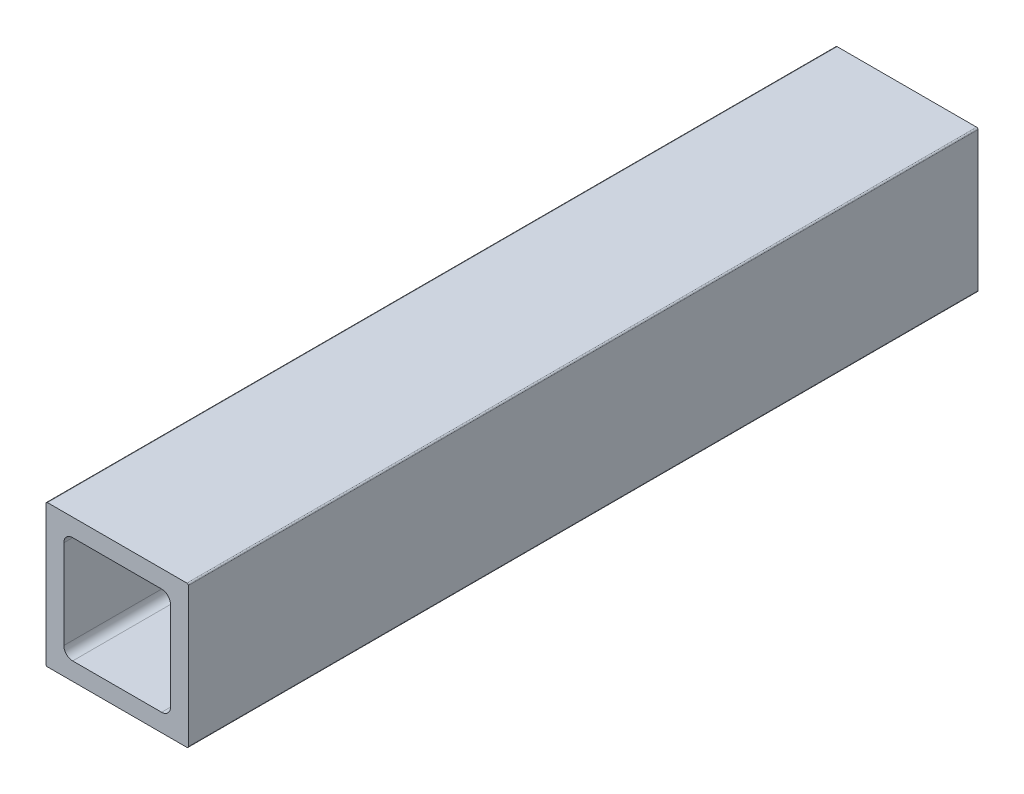
ISO-10303-21;
HEADER;
FILE_DESCRIPTION(('STEP AP214'),'2;1');
FILE_NAME('part.step','',(''),(''),'','','');
FILE_SCHEMA(('AUTOMOTIVE_DESIGN { 1 0 10303 214 1 1 1 1 }'));
ENDSEC;
DATA;
#1=APPLICATION_CONTEXT('core data for automotive mechanical design processes');
#2=APPLICATION_PROTOCOL_DEFINITION('international standard','automotive_design',2000,#1);
#3=PRODUCT_CONTEXT('',#1,'mechanical');
#4=PRODUCT('Part','Part','',(#3));
#5=PRODUCT_RELATED_PRODUCT_CATEGORY('part','',(#4));
#6=PRODUCT_DEFINITION_FORMATION('','',#4);
#7=PRODUCT_DEFINITION_CONTEXT('part definition',#1,'design');
#8=PRODUCT_DEFINITION('design','',#6,#7);
#9=PRODUCT_DEFINITION_SHAPE('','',#8);
#10=(LENGTH_UNIT() NAMED_UNIT(*) SI_UNIT(.MILLI.,.METRE.));
#11=(NAMED_UNIT(*) PLANE_ANGLE_UNIT() SI_UNIT($,.RADIAN.));
#12=(NAMED_UNIT(*) SI_UNIT($,.STERADIAN.) SOLID_ANGLE_UNIT());
#13=UNCERTAINTY_MEASURE_WITH_UNIT(LENGTH_MEASURE(1.E-05),#10,'distance_accuracy_value','');
#14=(GEOMETRIC_REPRESENTATION_CONTEXT(3) GLOBAL_UNCERTAINTY_ASSIGNED_CONTEXT((#13)) GLOBAL_UNIT_ASSIGNED_CONTEXT((#10,
#11,#12)) REPRESENTATION_CONTEXT('',''));
#15=CARTESIAN_POINT('',(0.,0.,0.));
#16=DIRECTION('',(0.,0.,1.));
#17=DIRECTION('',(1.,0.,0.));
#18=AXIS2_PLACEMENT_3D('',#15,#16,#17);
#19=CARTESIAN_POINT('',(0.254,0.254,0.));
#20=DIRECTION('',(0.,0.,-1.));
#21=DIRECTION('',(0.,-1.,0.));
#22=AXIS2_PLACEMENT_3D('',#19,#20,#21);
#23=PLANE('',#22);
#24=CARTESIAN_POINT('',(0.254,0.254,0.));
#25=DIRECTION('',(0.,0.,1.));
#26=DIRECTION('',(-1.,0.,0.));
#27=AXIS2_PLACEMENT_3D('',#24,#25,#26);
#28=CIRCLE('',#27,0.254);
#29=CARTESIAN_POINT('',(0.,0.254,0.));
#30=VERTEX_POINT('',#29);
#31=CARTESIAN_POINT('',(0.254,0.,0.));
#32=VERTEX_POINT('',#31);
#33=EDGE_CURVE('E193',#30,#32,#28,.T.);
#34=ORIENTED_EDGE('',*,*,#33,.F.);
#35=DIRECTION('',(0.,-1.,0.));
#36=VECTOR('',#35,1.);
#37=CARTESIAN_POINT('',(0.,0.254,0.));
#38=LINE('',#37,#36);
#39=CARTESIAN_POINT('',(0.,25.146,0.));
#40=VERTEX_POINT('',#39);
#41=EDGE_CURVE('E191',#40,#30,#38,.T.);
#42=ORIENTED_EDGE('',*,*,#41,.F.);
#43=CARTESIAN_POINT('',(0.254,25.146,0.));
#44=DIRECTION('',(0.,0.,1.));
#45=DIRECTION('',(-1.,0.,0.));
#46=AXIS2_PLACEMENT_3D('',#43,#44,#45);
#47=CIRCLE('',#46,0.254);
#48=CARTESIAN_POINT('',(0.254,25.4,0.));
#49=VERTEX_POINT('',#48);
#50=EDGE_CURVE('E213',#49,#40,#47,.T.);
#51=ORIENTED_EDGE('',*,*,#50,.F.);
#52=DIRECTION('',(-1.,0.,0.));
#53=VECTOR('',#52,1.);
#54=CARTESIAN_POINT('',(0.254,25.4,0.));
#55=LINE('',#54,#53);
#56=CARTESIAN_POINT('',(25.146,25.4,0.));
#57=VERTEX_POINT('',#56);
#58=EDGE_CURVE('E204',#57,#49,#55,.T.);
#59=ORIENTED_EDGE('',*,*,#58,.F.);
#60=CARTESIAN_POINT('',(25.146,25.146,0.));
#61=DIRECTION('',(0.,0.,1.));
#62=DIRECTION('',(-1.,0.,0.));
#63=AXIS2_PLACEMENT_3D('',#60,#61,#62);
#64=CIRCLE('',#63,0.254);
#65=CARTESIAN_POINT('',(25.4,25.146,0.));
#66=VERTEX_POINT('',#65);
#67=EDGE_CURVE('E236',#66,#57,#64,.T.);
#68=ORIENTED_EDGE('',*,*,#67,.F.);
#69=DIRECTION('',(0.,1.,0.));
#70=VECTOR('',#69,1.);
#71=CARTESIAN_POINT('',(25.4,0.254,0.));
#72=LINE('',#71,#70);
#73=CARTESIAN_POINT('',(25.4,0.254,0.));
#74=VERTEX_POINT('',#73);
#75=EDGE_CURVE('E235',#74,#66,#72,.T.);
#76=ORIENTED_EDGE('',*,*,#75,.F.);
#77=CARTESIAN_POINT('',(25.146,0.254,0.));
#78=DIRECTION('',(0.,0.,1.));
#79=DIRECTION('',(1.,0.,0.));
#80=AXIS2_PLACEMENT_3D('',#77,#78,#79);
#81=CIRCLE('',#80,0.254);
#82=CARTESIAN_POINT('',(25.146,0.,0.));
#83=VERTEX_POINT('',#82);
#84=EDGE_CURVE('E206',#83,#74,#81,.T.);
#85=ORIENTED_EDGE('',*,*,#84,.F.);
#86=DIRECTION('',(1.,0.,0.));
#87=VECTOR('',#86,1.);
#88=CARTESIAN_POINT('',(0.254,0.,0.));
#89=LINE('',#88,#87);
#90=EDGE_CURVE('E194',#32,#83,#89,.T.);
#91=ORIENTED_EDGE('',*,*,#90,.F.);
#92=EDGE_LOOP('',(#34,#42,#51,#59,#68,#76,#85,#91));
#93=FACE_BOUND('',#92,.T.);
#94=DIRECTION('',(0.,-1.,0.));
#95=VECTOR('',#94,1.);
#96=CARTESIAN_POINT('',(3.175,4.7625,0.));
#97=LINE('',#96,#95);
#98=CARTESIAN_POINT('',(3.175,20.6375,0.));
#99=VERTEX_POINT('',#98);
#100=CARTESIAN_POINT('',(3.175,4.7625,0.));
#101=VERTEX_POINT('',#100);
#102=EDGE_CURVE('E52',#99,#101,#97,.T.);
#103=ORIENTED_EDGE('',*,*,#102,.T.);
#104=CARTESIAN_POINT('',(4.7625,4.7625,0.));
#105=DIRECTION('',(0.,0.,1.));
#106=DIRECTION('',(1.,0.,0.));
#107=AXIS2_PLACEMENT_3D('',#104,#105,#106);
#108=CIRCLE('',#107,1.5875);
#109=CARTESIAN_POINT('',(4.7625,3.175,0.));
#110=VERTEX_POINT('',#109);
#111=EDGE_CURVE('E266',#101,#110,#108,.T.);
#112=ORIENTED_EDGE('',*,*,#111,.T.);
#113=DIRECTION('',(1.,0.,0.));
#114=VECTOR('',#113,1.);
#115=CARTESIAN_POINT('',(4.7625,3.175,0.));
#116=LINE('',#115,#114);
#117=CARTESIAN_POINT('',(20.6375,3.175,0.));
#118=VERTEX_POINT('',#117);
#119=EDGE_CURVE('E250',#110,#118,#116,.T.);
#120=ORIENTED_EDGE('',*,*,#119,.T.);
#121=CARTESIAN_POINT('',(20.6375,4.7625,0.));
#122=DIRECTION('',(0.,0.,1.));
#123=DIRECTION('',(-1.,0.,0.));
#124=AXIS2_PLACEMENT_3D('',#121,#122,#123);
#125=CIRCLE('',#124,1.5875);
#126=CARTESIAN_POINT('',(22.225,4.7625,0.));
#127=VERTEX_POINT('',#126);
#128=EDGE_CURVE('E223',#118,#127,#125,.T.);
#129=ORIENTED_EDGE('',*,*,#128,.T.);
#130=DIRECTION('',(0.,1.,0.));
#131=VECTOR('',#130,1.);
#132=CARTESIAN_POINT('',(22.225,4.7625,0.));
#133=LINE('',#132,#131);
#134=CARTESIAN_POINT('',(22.225,20.6375,0.));
#135=VERTEX_POINT('',#134);
#136=EDGE_CURVE('E219',#127,#135,#133,.T.);
#137=ORIENTED_EDGE('',*,*,#136,.T.);
#138=CARTESIAN_POINT('',(20.6375,20.6375,0.));
#139=DIRECTION('',(0.,0.,1.));
#140=DIRECTION('',(-1.,0.,0.));
#141=AXIS2_PLACEMENT_3D('',#138,#139,#140);
#142=CIRCLE('',#141,1.5875);
#143=CARTESIAN_POINT('',(20.6375,22.225,0.));
#144=VERTEX_POINT('',#143);
#145=EDGE_CURVE('E224',#135,#144,#142,.T.);
#146=ORIENTED_EDGE('',*,*,#145,.T.);
#147=DIRECTION('',(-1.,0.,0.));
#148=VECTOR('',#147,1.);
#149=CARTESIAN_POINT('',(4.7625,22.225,0.));
#150=LINE('',#149,#148);
#151=CARTESIAN_POINT('',(4.7625,22.225,0.));
#152=VERTEX_POINT('',#151);
#153=EDGE_CURVE('E229',#144,#152,#150,.T.);
#154=ORIENTED_EDGE('',*,*,#153,.T.);
#155=CARTESIAN_POINT('',(4.7625,20.6375,0.));
#156=DIRECTION('',(0.,0.,1.));
#157=DIRECTION('',(-1.,0.,0.));
#158=AXIS2_PLACEMENT_3D('',#155,#156,#157);
#159=CIRCLE('',#158,1.5875);
#160=EDGE_CURVE('E197',#152,#99,#159,.T.);
#161=ORIENTED_EDGE('',*,*,#160,.T.);
#162=EDGE_LOOP('',(#103,#112,#120,#129,#137,#146,#154,#161));
#163=FACE_BOUND('',#162,.T.);
#164=ADVANCED_FACE('F44',(#93,#163),#23,.T.);
#165=CARTESIAN_POINT('',(0.254,0.254,1828.8));
#166=DIRECTION('',(0.,0.,-1.));
#167=DIRECTION('',(-1.,0.,0.));
#168=AXIS2_PLACEMENT_3D('',#165,#166,#167);
#169=CYLINDRICAL_SURFACE('',#168,0.254);
#170=CARTESIAN_POINT('',(0.254,0.254,140.97));
#171=DIRECTION('',(0.,0.,-1.));
#172=DIRECTION('',(-1.,0.,0.));
#173=AXIS2_PLACEMENT_3D('',#170,#171,#172);
#174=CIRCLE('',#173,0.254);
#175=CARTESIAN_POINT('',(0.,0.254,140.97));
#176=VERTEX_POINT('',#175);
#177=CARTESIAN_POINT('',(0.254,0.,140.97));
#178=VERTEX_POINT('',#177);
#179=EDGE_CURVE('E172',#176,#178,#174,.F.);
#180=ORIENTED_EDGE('',*,*,#179,.F.);
#181=DIRECTION('',(0.,0.,-1.));
#182=VECTOR('',#181,1.);
#183=CARTESIAN_POINT('',(0.,0.254,1828.8));
#184=LINE('',#183,#182);
#185=EDGE_CURVE('E183',#176,#30,#184,.T.);
#186=ORIENTED_EDGE('',*,*,#185,.T.);
#187=ORIENTED_EDGE('',*,*,#33,.T.);
#188=DIRECTION('',(0.,0.,-1.));
#189=VECTOR('',#188,1.);
#190=CARTESIAN_POINT('',(0.254,0.,1828.8));
#191=LINE('',#190,#189);
#192=EDGE_CURVE('E185',#178,#32,#191,.T.);
#193=ORIENTED_EDGE('',*,*,#192,.F.);
#194=EDGE_LOOP('',(#180,#186,#187,#193));
#195=FACE_BOUND('',#194,.T.);
#196=ADVANCED_FACE('F181',(#195),#169,.T.);
#197=CARTESIAN_POINT('',(0.254,0.,1828.8));
#198=DIRECTION('',(0.,1.,0.));
#199=DIRECTION('',(1.,0.,0.));
#200=AXIS2_PLACEMENT_3D('',#197,#198,#199);
#201=PLANE('',#200);
#202=DIRECTION('',(0.,0.,-1.));
#203=VECTOR('',#202,1.);
#204=CARTESIAN_POINT('',(25.146,0.,1828.8));
#205=LINE('',#204,#203);
#206=CARTESIAN_POINT('',(25.146,0.,140.97));
#207=VERTEX_POINT('',#206);
#208=EDGE_CURVE('E210',#207,#83,#205,.T.);
#209=ORIENTED_EDGE('',*,*,#208,.F.);
#210=DIRECTION('',(1.,0.,0.));
#211=VECTOR('',#210,1.);
#212=CARTESIAN_POINT('',(0.,0.,140.97));
#213=LINE('',#212,#211);
#214=EDGE_CURVE('E177',#178,#207,#213,.T.);
#215=ORIENTED_EDGE('',*,*,#214,.F.);
#216=ORIENTED_EDGE('',*,*,#192,.T.);
#217=ORIENTED_EDGE('',*,*,#90,.T.);
#218=EDGE_LOOP('',(#209,#215,#216,#217));
#219=FACE_BOUND('',#218,.T.);
#220=ADVANCED_FACE('F289',(#219),#201,.F.);
#221=CARTESIAN_POINT('',(25.146,0.254,1828.8));
#222=DIRECTION('',(0.,0.,-1.));
#223=DIRECTION('',(-1.,0.,0.));
#224=AXIS2_PLACEMENT_3D('',#221,#222,#223);
#225=CYLINDRICAL_SURFACE('',#224,0.254);
#226=CARTESIAN_POINT('',(25.146,0.254,140.97));
#227=DIRECTION('',(0.,0.,-1.));
#228=DIRECTION('',(-1.,0.,0.));
#229=AXIS2_PLACEMENT_3D('',#226,#227,#228);
#230=CIRCLE('',#229,0.254);
#231=CARTESIAN_POINT('',(25.4,0.254,140.97));
#232=VERTEX_POINT('',#231);
#233=EDGE_CURVE('E187',#207,#232,#230,.F.);
#234=ORIENTED_EDGE('',*,*,#233,.F.);
#235=ORIENTED_EDGE('',*,*,#208,.T.);
#236=ORIENTED_EDGE('',*,*,#84,.T.);
#237=DIRECTION('',(0.,0.,-1.));
#238=VECTOR('',#237,1.);
#239=CARTESIAN_POINT('',(25.4,0.254,1828.8));
#240=LINE('',#239,#238);
#241=EDGE_CURVE('E233',#232,#74,#240,.T.);
#242=ORIENTED_EDGE('',*,*,#241,.F.);
#243=EDGE_LOOP('',(#234,#235,#236,#242));
#244=FACE_BOUND('',#243,.T.);
#245=ADVANCED_FACE('F283',(#244),#225,.T.);
#246=CARTESIAN_POINT('',(25.4,0.254,1828.8));
#247=DIRECTION('',(-1.,0.,0.));
#248=DIRECTION('',(0.,0.,1.));
#249=AXIS2_PLACEMENT_3D('',#246,#247,#248);
#250=PLANE('',#249);
#251=DIRECTION('',(0.,0.,-1.));
#252=VECTOR('',#251,1.);
#253=CARTESIAN_POINT('',(25.4,25.146,1828.8));
#254=LINE('',#253,#252);
#255=CARTESIAN_POINT('',(25.4,25.146,140.97));
#256=VERTEX_POINT('',#255);
#257=EDGE_CURVE('E258',#256,#66,#254,.T.);
#258=ORIENTED_EDGE('',*,*,#257,.F.);
#259=DIRECTION('',(0.,1.,0.));
#260=VECTOR('',#259,1.);
#261=CARTESIAN_POINT('',(25.4,0.,140.97));
#262=LINE('',#261,#260);
#263=EDGE_CURVE('E498',#232,#256,#262,.T.);
#264=ORIENTED_EDGE('',*,*,#263,.F.);
#265=ORIENTED_EDGE('',*,*,#241,.T.);
#266=ORIENTED_EDGE('',*,*,#75,.T.);
#267=EDGE_LOOP('',(#258,#264,#265,#266));
#268=FACE_BOUND('',#267,.T.);
#269=ADVANCED_FACE('F288',(#268),#250,.F.);
#270=CARTESIAN_POINT('',(25.146,25.146,1828.8));
#271=DIRECTION('',(0.,0.,-1.));
#272=DIRECTION('',(-1.,0.,0.));
#273=AXIS2_PLACEMENT_3D('',#270,#271,#272);
#274=CYLINDRICAL_SURFACE('',#273,0.254);
#275=CARTESIAN_POINT('',(25.146,25.146,140.97));
#276=DIRECTION('',(0.,0.,-1.));
#277=DIRECTION('',(-1.,0.,0.));
#278=AXIS2_PLACEMENT_3D('',#275,#276,#277);
#279=CIRCLE('',#278,0.254);
#280=CARTESIAN_POINT('',(25.146,25.4,140.97));
#281=VERTEX_POINT('',#280);
#282=EDGE_CURVE('E492',#256,#281,#279,.F.);
#283=ORIENTED_EDGE('',*,*,#282,.F.);
#284=ORIENTED_EDGE('',*,*,#257,.T.);
#285=ORIENTED_EDGE('',*,*,#67,.T.);
#286=DIRECTION('',(0.,0.,-1.));
#287=VECTOR('',#286,1.);
#288=CARTESIAN_POINT('',(25.146,25.4,1828.8));
#289=LINE('',#288,#287);
#290=EDGE_CURVE('E227',#281,#57,#289,.T.);
#291=ORIENTED_EDGE('',*,*,#290,.F.);
#292=EDGE_LOOP('',(#283,#284,#285,#291));
#293=FACE_BOUND('',#292,.T.);
#294=ADVANCED_FACE('F46',(#293),#274,.T.);
#295=CARTESIAN_POINT('',(0.254,25.4,1828.8));
#296=DIRECTION('',(0.,-1.,0.));
#297=DIRECTION('',(0.,0.,-1.));
#298=AXIS2_PLACEMENT_3D('',#295,#296,#297);
#299=PLANE('',#298);
#300=DIRECTION('',(0.,0.,-1.));
#301=VECTOR('',#300,1.);
#302=CARTESIAN_POINT('',(0.254,25.4,1828.8));
#303=LINE('',#302,#301);
#304=CARTESIAN_POINT('',(0.254,25.4,140.97));
#305=VERTEX_POINT('',#304);
#306=EDGE_CURVE('E211',#305,#49,#303,.T.);
#307=ORIENTED_EDGE('',*,*,#306,.F.);
#308=DIRECTION('',(-1.,0.,0.));
#309=VECTOR('',#308,1.);
#310=CARTESIAN_POINT('',(0.,25.4,140.97));
#311=LINE('',#310,#309);
#312=EDGE_CURVE('E545',#281,#305,#311,.T.);
#313=ORIENTED_EDGE('',*,*,#312,.F.);
#314=ORIENTED_EDGE('',*,*,#290,.T.);
#315=ORIENTED_EDGE('',*,*,#58,.T.);
#316=EDGE_LOOP('',(#307,#313,#314,#315));
#317=FACE_BOUND('',#316,.T.);
#318=ADVANCED_FACE('F347',(#317),#299,.F.);
#319=CARTESIAN_POINT('',(0.254,25.146,1828.8));
#320=DIRECTION('',(0.,0.,-1.));
#321=DIRECTION('',(-1.,0.,0.));
#322=AXIS2_PLACEMENT_3D('',#319,#320,#321);
#323=CYLINDRICAL_SURFACE('',#322,0.254);
#324=CARTESIAN_POINT('',(0.254,25.146,140.97));
#325=DIRECTION('',(0.,0.,-1.));
#326=DIRECTION('',(-1.,0.,0.));
#327=AXIS2_PLACEMENT_3D('',#324,#325,#326);
#328=CIRCLE('',#327,0.254);
#329=CARTESIAN_POINT('',(0.,25.146,140.97));
#330=VERTEX_POINT('',#329);
#331=EDGE_CURVE('E59',#305,#330,#328,.F.);
#332=ORIENTED_EDGE('',*,*,#331,.F.);
#333=ORIENTED_EDGE('',*,*,#306,.T.);
#334=ORIENTED_EDGE('',*,*,#50,.T.);
#335=DIRECTION('',(0.,0.,-1.));
#336=VECTOR('',#335,1.);
#337=CARTESIAN_POINT('',(0.,25.146,1828.8));
#338=LINE('',#337,#336);
#339=EDGE_CURVE('E216',#330,#40,#338,.T.);
#340=ORIENTED_EDGE('',*,*,#339,.F.);
#341=EDGE_LOOP('',(#332,#333,#334,#340));
#342=FACE_BOUND('',#341,.T.);
#343=ADVANCED_FACE('F276',(#342),#323,.T.);
#344=CARTESIAN_POINT('',(0.,0.254,1828.8));
#345=DIRECTION('',(1.,0.,0.));
#346=DIRECTION('',(0.,1.,0.));
#347=AXIS2_PLACEMENT_3D('',#344,#345,#346);
#348=PLANE('',#347);
#349=ORIENTED_EDGE('',*,*,#185,.F.);
#350=DIRECTION('',(0.,-1.,0.));
#351=VECTOR('',#350,1.);
#352=CARTESIAN_POINT('',(0.,0.,140.97));
#353=LINE('',#352,#351);
#354=EDGE_CURVE('E169',#330,#176,#353,.T.);
#355=ORIENTED_EDGE('',*,*,#354,.F.);
#356=ORIENTED_EDGE('',*,*,#339,.T.);
#357=ORIENTED_EDGE('',*,*,#41,.T.);
#358=EDGE_LOOP('',(#349,#355,#356,#357));
#359=FACE_BOUND('',#358,.T.);
#360=ADVANCED_FACE('F189',(#359),#348,.F.);
#361=CARTESIAN_POINT('',(4.7625,4.7625,1828.8));
#362=DIRECTION('',(0.,0.,-1.));
#363=DIRECTION('',(-1.,0.,0.));
#364=AXIS2_PLACEMENT_3D('',#361,#362,#363);
#365=CYLINDRICAL_SURFACE('',#364,1.5875);
#366=DIRECTION('',(0.,0.,-1.));
#367=VECTOR('',#366,1.);
#368=CARTESIAN_POINT('',(3.175,4.7625,1828.8));
#369=LINE('',#368,#367);
#370=CARTESIAN_POINT('',(3.175,4.7625,140.97));
#371=VERTEX_POINT('',#370);
#372=EDGE_CURVE('E186',#371,#101,#369,.T.);
#373=ORIENTED_EDGE('',*,*,#372,.F.);
#374=CARTESIAN_POINT('',(4.7625,4.7625,140.97));
#375=DIRECTION('',(0.,0.,-1.));
#376=DIRECTION('',(-1.,0.,0.));
#377=AXIS2_PLACEMENT_3D('',#374,#375,#376);
#378=CIRCLE('',#377,1.5875);
#379=CARTESIAN_POINT('',(4.7625,3.175,140.97));
#380=VERTEX_POINT('',#379);
#381=EDGE_CURVE('E66',#371,#380,#378,.F.);
#382=ORIENTED_EDGE('',*,*,#381,.T.);
#383=DIRECTION('',(0.,0.,-1.));
#384=VECTOR('',#383,1.);
#385=CARTESIAN_POINT('',(4.7625,3.175,1828.8));
#386=LINE('',#385,#384);
#387=EDGE_CURVE('E214',#380,#110,#386,.T.);
#388=ORIENTED_EDGE('',*,*,#387,.T.);
#389=ORIENTED_EDGE('',*,*,#111,.F.);
#390=EDGE_LOOP('',(#373,#382,#388,#389));
#391=FACE_BOUND('',#390,.T.);
#392=ADVANCED_FACE('F275',(#391),#365,.F.);
#393=CARTESIAN_POINT('',(4.7625,3.175,1828.8));
#394=DIRECTION('',(0.,1.,0.));
#395=DIRECTION('',(1.,0.,0.));
#396=AXIS2_PLACEMENT_3D('',#393,#394,#395);
#397=PLANE('',#396);
#398=DIRECTION('',(-1.,0.,0.));
#399=VECTOR('',#398,1.);
#400=CARTESIAN_POINT('',(4.7625,3.175,140.97));
#401=LINE('',#400,#399);
#402=CARTESIAN_POINT('',(20.6375,3.175,140.97));
#403=VERTEX_POINT('',#402);
#404=EDGE_CURVE('E532',#403,#380,#401,.T.);
#405=ORIENTED_EDGE('',*,*,#404,.F.);
#406=DIRECTION('',(0.,0.,-1.));
#407=VECTOR('',#406,1.);
#408=CARTESIAN_POINT('',(20.6375,3.175,1828.8));
#409=LINE('',#408,#407);
#410=EDGE_CURVE('E217',#403,#118,#409,.T.);
#411=ORIENTED_EDGE('',*,*,#410,.T.);
#412=ORIENTED_EDGE('',*,*,#119,.F.);
#413=ORIENTED_EDGE('',*,*,#387,.F.);
#414=EDGE_LOOP('',(#405,#411,#412,#413));
#415=FACE_BOUND('',#414,.T.);
#416=ADVANCED_FACE('F302',(#415),#397,.T.);
#417=CARTESIAN_POINT('',(20.6375,4.7625,1828.8));
#418=DIRECTION('',(0.,0.,-1.));
#419=DIRECTION('',(-1.,0.,0.));
#420=AXIS2_PLACEMENT_3D('',#417,#418,#419);
#421=CYLINDRICAL_SURFACE('',#420,1.5875);
#422=ORIENTED_EDGE('',*,*,#410,.F.);
#423=CARTESIAN_POINT('',(20.6375,4.7625,140.97));
#424=DIRECTION('',(0.,0.,-1.));
#425=DIRECTION('',(-1.,0.,0.));
#426=AXIS2_PLACEMENT_3D('',#423,#424,#425);
#427=CIRCLE('',#426,1.5875);
#428=CARTESIAN_POINT('',(22.225,4.7625,140.97));
#429=VERTEX_POINT('',#428);
#430=EDGE_CURVE('E513',#403,#429,#427,.F.);
#431=ORIENTED_EDGE('',*,*,#430,.T.);
#432=DIRECTION('',(0.,0.,-1.));
#433=VECTOR('',#432,1.);
#434=CARTESIAN_POINT('',(22.225,4.7625,1828.8));
#435=LINE('',#434,#433);
#436=EDGE_CURVE('E254',#429,#127,#435,.T.);
#437=ORIENTED_EDGE('',*,*,#436,.T.);
#438=ORIENTED_EDGE('',*,*,#128,.F.);
#439=EDGE_LOOP('',(#422,#431,#437,#438));
#440=FACE_BOUND('',#439,.T.);
#441=ADVANCED_FACE('F297',(#440),#421,.F.);
#442=CARTESIAN_POINT('',(22.225,4.7625,1828.8));
#443=DIRECTION('',(-1.,0.,0.));
#444=DIRECTION('',(0.,0.,1.));
#445=AXIS2_PLACEMENT_3D('',#442,#443,#444);
#446=PLANE('',#445);
#447=DIRECTION('',(0.,-1.,0.));
#448=VECTOR('',#447,1.);
#449=CARTESIAN_POINT('',(22.225,4.7625,140.97));
#450=LINE('',#449,#448);
#451=CARTESIAN_POINT('',(22.225,20.6375,140.97));
#452=VERTEX_POINT('',#451);
#453=EDGE_CURVE('E535',#452,#429,#450,.T.);
#454=ORIENTED_EDGE('',*,*,#453,.F.);
#455=DIRECTION('',(0.,0.,-1.));
#456=VECTOR('',#455,1.);
#457=CARTESIAN_POINT('',(22.225,20.6375,1828.8));
#458=LINE('',#457,#456);
#459=EDGE_CURVE('E240',#452,#135,#458,.T.);
#460=ORIENTED_EDGE('',*,*,#459,.T.);
#461=ORIENTED_EDGE('',*,*,#136,.F.);
#462=ORIENTED_EDGE('',*,*,#436,.F.);
#463=EDGE_LOOP('',(#454,#460,#461,#462));
#464=FACE_BOUND('',#463,.T.);
#465=ADVANCED_FACE('F301',(#464),#446,.T.);
#466=CARTESIAN_POINT('',(20.6375,20.6375,1828.8));
#467=DIRECTION('',(0.,0.,-1.));
#468=DIRECTION('',(-1.,0.,0.));
#469=AXIS2_PLACEMENT_3D('',#466,#467,#468);
#470=CYLINDRICAL_SURFACE('',#469,1.5875);
#471=ORIENTED_EDGE('',*,*,#459,.F.);
#472=CARTESIAN_POINT('',(20.6375,20.6375,140.97));
#473=DIRECTION('',(0.,0.,-1.));
#474=DIRECTION('',(-1.,0.,0.));
#475=AXIS2_PLACEMENT_3D('',#472,#473,#474);
#476=CIRCLE('',#475,1.5875);
#477=CARTESIAN_POINT('',(20.6375,22.225,140.97));
#478=VERTEX_POINT('',#477);
#479=EDGE_CURVE('E537',#452,#478,#476,.F.);
#480=ORIENTED_EDGE('',*,*,#479,.T.);
#481=DIRECTION('',(0.,0.,-1.));
#482=VECTOR('',#481,1.);
#483=CARTESIAN_POINT('',(20.6375,22.225,1828.8));
#484=LINE('',#483,#482);
#485=EDGE_CURVE('E238',#478,#144,#484,.T.);
#486=ORIENTED_EDGE('',*,*,#485,.T.);
#487=ORIENTED_EDGE('',*,*,#145,.F.);
#488=EDGE_LOOP('',(#471,#480,#486,#487));
#489=FACE_BOUND('',#488,.T.);
#490=ADVANCED_FACE('F309',(#489),#470,.F.);
#491=CARTESIAN_POINT('',(4.7625,22.225,1828.8));
#492=DIRECTION('',(0.,-1.,0.));
#493=DIRECTION('',(0.,0.,-1.));
#494=AXIS2_PLACEMENT_3D('',#491,#492,#493);
#495=PLANE('',#494);
#496=DIRECTION('',(1.,0.,0.));
#497=VECTOR('',#496,1.);
#498=CARTESIAN_POINT('',(4.7625,22.225,140.97));
#499=LINE('',#498,#497);
#500=CARTESIAN_POINT('',(4.7625,22.225,140.97));
#501=VERTEX_POINT('',#500);
#502=EDGE_CURVE('E540',#501,#478,#499,.T.);
#503=ORIENTED_EDGE('',*,*,#502,.F.);
#504=DIRECTION('',(0.,0.,-1.));
#505=VECTOR('',#504,1.);
#506=CARTESIAN_POINT('',(4.7625,22.225,1828.8));
#507=LINE('',#506,#505);
#508=EDGE_CURVE('E241',#501,#152,#507,.T.);
#509=ORIENTED_EDGE('',*,*,#508,.T.);
#510=ORIENTED_EDGE('',*,*,#153,.F.);
#511=ORIENTED_EDGE('',*,*,#485,.F.);
#512=EDGE_LOOP('',(#503,#509,#510,#511));
#513=FACE_BOUND('',#512,.T.);
#514=ADVANCED_FACE('F313',(#513),#495,.T.);
#515=CARTESIAN_POINT('',(4.7625,20.6375,1828.8));
#516=DIRECTION('',(0.,0.,-1.));
#517=DIRECTION('',(-1.,0.,0.));
#518=AXIS2_PLACEMENT_3D('',#515,#516,#517);
#519=CYLINDRICAL_SURFACE('',#518,1.5875);
#520=ORIENTED_EDGE('',*,*,#508,.F.);
#521=CARTESIAN_POINT('',(4.7625,20.6375,140.97));
#522=DIRECTION('',(0.,0.,-1.));
#523=DIRECTION('',(-1.,0.,0.));
#524=AXIS2_PLACEMENT_3D('',#521,#522,#523);
#525=CIRCLE('',#524,1.5875);
#526=CARTESIAN_POINT('',(3.175,20.6375,140.97));
#527=VERTEX_POINT('',#526);
#528=EDGE_CURVE('E542',#501,#527,#525,.F.);
#529=ORIENTED_EDGE('',*,*,#528,.T.);
#530=DIRECTION('',(0.,0.,-1.));
#531=VECTOR('',#530,1.);
#532=CARTESIAN_POINT('',(3.175,20.6375,1828.8));
#533=LINE('',#532,#531);
#534=EDGE_CURVE('E245',#527,#99,#533,.T.);
#535=ORIENTED_EDGE('',*,*,#534,.T.);
#536=ORIENTED_EDGE('',*,*,#160,.F.);
#537=EDGE_LOOP('',(#520,#529,#535,#536));
#538=FACE_BOUND('',#537,.T.);
#539=ADVANCED_FACE('F390',(#538),#519,.F.);
#540=CARTESIAN_POINT('',(3.175,4.7625,1828.8));
#541=DIRECTION('',(1.,0.,0.));
#542=DIRECTION('',(0.,1.,0.));
#543=AXIS2_PLACEMENT_3D('',#540,#541,#542);
#544=PLANE('',#543);
#545=DIRECTION('',(0.,1.,0.));
#546=VECTOR('',#545,1.);
#547=CARTESIAN_POINT('',(3.175,4.7625,140.97));
#548=LINE('',#547,#546);
#549=EDGE_CURVE('E11',#371,#527,#548,.T.);
#550=ORIENTED_EDGE('',*,*,#549,.F.);
#551=ORIENTED_EDGE('',*,*,#372,.T.);
#552=ORIENTED_EDGE('',*,*,#102,.F.);
#553=ORIENTED_EDGE('',*,*,#534,.F.);
#554=EDGE_LOOP('',(#550,#551,#552,#553));
#555=FACE_BOUND('',#554,.T.);
#556=ADVANCED_FACE('F394',(#555),#544,.T.);
#557=CARTESIAN_POINT('',(0.,0.,140.97));
#558=DIRECTION('',(0.,0.,-1.));
#559=DIRECTION('',(-1.,0.,0.));
#560=AXIS2_PLACEMENT_3D('',#557,#558,#559);
#561=PLANE('',#560);
#562=ORIENTED_EDGE('',*,*,#179,.T.);
#563=ORIENTED_EDGE('',*,*,#214,.T.);
#564=ORIENTED_EDGE('',*,*,#233,.T.);
#565=ORIENTED_EDGE('',*,*,#263,.T.);
#566=ORIENTED_EDGE('',*,*,#282,.T.);
#567=ORIENTED_EDGE('',*,*,#312,.T.);
#568=ORIENTED_EDGE('',*,*,#331,.T.);
#569=ORIENTED_EDGE('',*,*,#354,.T.);
#570=EDGE_LOOP('',(#562,#563,#564,#565,#566,#567,#568,#569));
#571=FACE_BOUND('',#570,.T.);
#572=ORIENTED_EDGE('',*,*,#549,.T.);
#573=ORIENTED_EDGE('',*,*,#528,.F.);
#574=ORIENTED_EDGE('',*,*,#502,.T.);
#575=ORIENTED_EDGE('',*,*,#479,.F.);
#576=ORIENTED_EDGE('',*,*,#453,.T.);
#577=ORIENTED_EDGE('',*,*,#430,.F.);
#578=ORIENTED_EDGE('',*,*,#404,.T.);
#579=ORIENTED_EDGE('',*,*,#381,.F.);
#580=EDGE_LOOP('',(#572,#573,#574,#575,#576,#577,#578,#579));
#581=FACE_BOUND('',#580,.T.);
#582=ADVANCED_FACE('F171',(#571,#581),#561,.F.);
#583=CLOSED_SHELL('',(#164,#196,#220,#245,#269,#294,#318,#343,#360,#392,#416,#441,#465,#490,
#514,#539,#556,#582));
#584=MANIFOLD_SOLID_BREP('B2',#583);
#585=ADVANCED_BREP_SHAPE_REPRESENTATION('',(#18,#584),#14);
#586=SHAPE_DEFINITION_REPRESENTATION(#9,#585);
ENDSEC;
END-ISO-10303-21;
